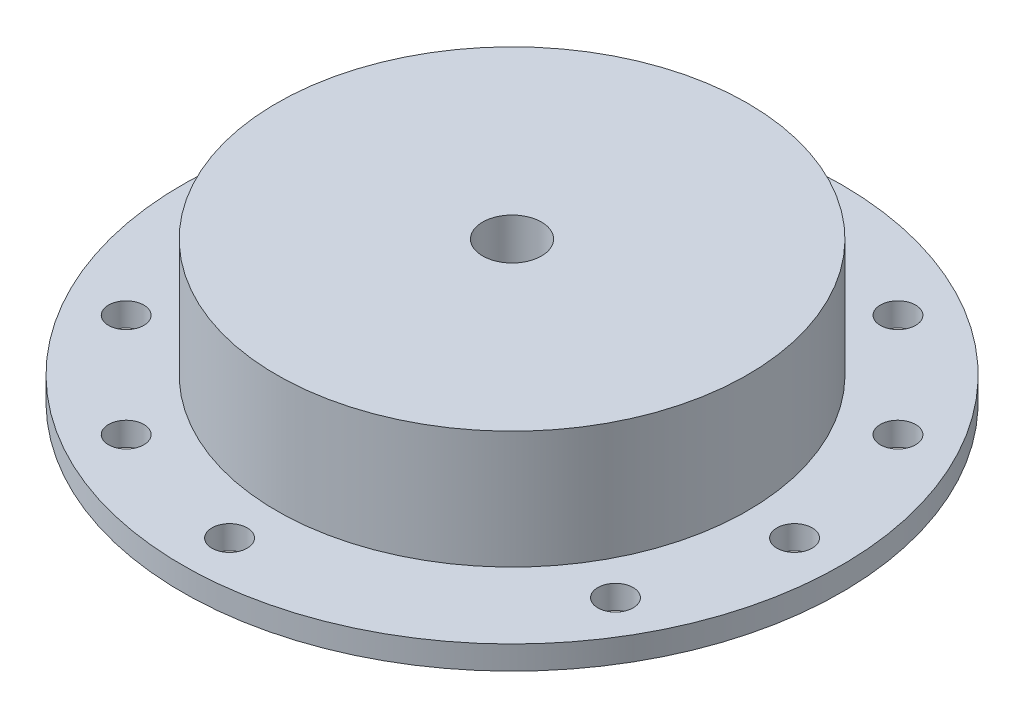
ISO-10303-21;
HEADER;
FILE_DESCRIPTION(('STEP AP214'),'2;1');
FILE_NAME('part.step','',(''),(''),'','','');
FILE_SCHEMA(('AUTOMOTIVE_DESIGN { 1 0 10303 214 1 1 1 1 }'));
ENDSEC;
DATA;
#1=APPLICATION_CONTEXT('core data for automotive mechanical design processes');
#2=APPLICATION_PROTOCOL_DEFINITION('international standard','automotive_design',2000,#1);
#3=PRODUCT_CONTEXT('',#1,'mechanical');
#4=PRODUCT('Part','Part','',(#3));
#5=PRODUCT_RELATED_PRODUCT_CATEGORY('part','',(#4));
#6=PRODUCT_DEFINITION_FORMATION('','',#4);
#7=PRODUCT_DEFINITION_CONTEXT('part definition',#1,'design');
#8=PRODUCT_DEFINITION('design','',#6,#7);
#9=PRODUCT_DEFINITION_SHAPE('','',#8);
#10=(LENGTH_UNIT() NAMED_UNIT(*) SI_UNIT(.MILLI.,.METRE.));
#11=(NAMED_UNIT(*) PLANE_ANGLE_UNIT() SI_UNIT($,.RADIAN.));
#12=(NAMED_UNIT(*) SI_UNIT($,.STERADIAN.) SOLID_ANGLE_UNIT());
#13=UNCERTAINTY_MEASURE_WITH_UNIT(LENGTH_MEASURE(1.E-05),#10,'distance_accuracy_value','');
#14=(GEOMETRIC_REPRESENTATION_CONTEXT(3) GLOBAL_UNCERTAINTY_ASSIGNED_CONTEXT((#13)) GLOBAL_UNIT_ASSIGNED_CONTEXT((#10,
#11,#12)) REPRESENTATION_CONTEXT('',''));
#15=CARTESIAN_POINT('',(0.,0.,0.));
#16=DIRECTION('',(0.,0.,1.));
#17=DIRECTION('',(1.,0.,0.));
#18=AXIS2_PLACEMENT_3D('',#15,#16,#17);
#19=CARTESIAN_POINT('',(63.5,38.1,0.));
#20=DIRECTION('',(0.,1.,0.));
#21=DIRECTION('',(0.,0.,1.));
#22=AXIS2_PLACEMENT_3D('',#19,#20,#21);
#23=PLANE('',#22);
#24=CARTESIAN_POINT('',(0.,38.1,0.));
#25=DIRECTION('',(0.,-1.,0.));
#26=DIRECTION('',(0.,0.,-1.));
#27=AXIS2_PLACEMENT_3D('',#24,#25,#26);
#28=CIRCLE('',#27,7.9375);
#29=CARTESIAN_POINT('',(0.,38.1,-7.9375));
#30=VERTEX_POINT('',#29);
#31=EDGE_CURVE('E10',#30,#30,#28,.T.);
#32=ORIENTED_EDGE('',*,*,#31,.T.);
#33=EDGE_LOOP('',(#32));
#34=FACE_BOUND('',#33,.T.);
#35=CARTESIAN_POINT('',(0.,38.1,0.));
#36=DIRECTION('',(0.,-1.,0.));
#37=DIRECTION('',(0.,0.,-1.));
#38=AXIS2_PLACEMENT_3D('',#35,#36,#37);
#39=CIRCLE('',#38,63.5);
#40=CARTESIAN_POINT('',(0.,38.1,-63.5));
#41=VERTEX_POINT('',#40);
#42=EDGE_CURVE('E56',#41,#41,#39,.T.);
#43=ORIENTED_EDGE('',*,*,#42,.F.);
#44=EDGE_LOOP('',(#43));
#45=FACE_BOUND('',#44,.T.);
#46=ADVANCED_FACE('F31',(#34,#45),#23,.T.);
#47=CARTESIAN_POINT('',(0.,0.,0.));
#48=DIRECTION('',(0.,-1.,0.));
#49=DIRECTION('',(0.,0.,-1.));
#50=AXIS2_PLACEMENT_3D('',#47,#48,#49);
#51=CYLINDRICAL_SURFACE('',#50,7.9375);
#52=CARTESIAN_POINT('',(0.,11.1125,0.));
#53=DIRECTION('',(0.,-1.,0.));
#54=DIRECTION('',(0.,0.,-1.));
#55=AXIS2_PLACEMENT_3D('',#52,#53,#54);
#56=CIRCLE('',#55,7.9375);
#57=CARTESIAN_POINT('',(0.,11.1125,-7.9375));
#58=VERTEX_POINT('',#57);
#59=EDGE_CURVE('E37',#58,#58,#56,.T.);
#60=ORIENTED_EDGE('',*,*,#59,.T.);
#61=EDGE_LOOP('',(#60));
#62=FACE_BOUND('',#61,.T.);
#63=ORIENTED_EDGE('',*,*,#31,.F.);
#64=EDGE_LOOP('',(#63));
#65=FACE_BOUND('',#64,.T.);
#66=ADVANCED_FACE('F173',(#62,#65),#51,.F.);
#67=CARTESIAN_POINT('',(0.,46.4910714285714,0.));
#68=DIRECTION('',(0.,-1.,0.));
#69=DIRECTION('',(0.,0.,-1.));
#70=AXIS2_PLACEMENT_3D('',#67,#68,#69);
#71=DEGENERATE_TOROIDAL_SURFACE('',#70,38.1,46.4910714285714,.T.);
#72=CARTESIAN_POINT('',(0.,0.,0.));
#73=DIRECTION('',(0.,-1.,0.));
#74=DIRECTION('',(0.,0.,-1.));
#75=AXIS2_PLACEMENT_3D('',#72,#73,#74);
#76=CIRCLE('',#75,38.1);
#77=CARTESIAN_POINT('',(0.,0.,-38.1));
#78=VERTEX_POINT('',#77);
#79=EDGE_CURVE('E41',#78,#78,#76,.T.);
#80=ORIENTED_EDGE('',*,*,#79,.T.);
#81=EDGE_LOOP('',(#80));
#82=FACE_BOUND('',#81,.T.);
#83=ORIENTED_EDGE('',*,*,#59,.F.);
#84=EDGE_LOOP('',(#83));
#85=FACE_BOUND('',#84,.T.);
#86=ADVANCED_FACE('F166',(#82,#85),#71,.T.);
#87=CARTESIAN_POINT('',(38.1,0.,0.));
#88=DIRECTION('',(0.,-1.,0.));
#89=DIRECTION('',(0.,0.,-1.));
#90=AXIS2_PLACEMENT_3D('',#87,#88,#89);
#91=PLANE('',#90);
#92=CARTESIAN_POINT('',(-38.0999999999991,0.,65.9911357683747));
#93=DIRECTION('',(0.,1.,0.));
#94=DIRECTION('',(0.,0.,1.));
#95=AXIS2_PLACEMENT_3D('',#92,#93,#94);
#96=CIRCLE('',#95,4.76249999999999);
#97=CARTESIAN_POINT('',(-38.0999999999991,0.,70.7536357683747));
#98=VERTEX_POINT('',#97);
#99=EDGE_CURVE('E119',#98,#98,#96,.T.);
#100=ORIENTED_EDGE('',*,*,#99,.T.);
#101=EDGE_LOOP('',(#100));
#102=FACE_BOUND('',#101,.T.);
#103=CARTESIAN_POINT('',(-65.9911357683738,0.,38.1000000000008));
#104=DIRECTION('',(0.,1.,0.));
#105=DIRECTION('',(0.,0.,1.));
#106=AXIS2_PLACEMENT_3D('',#103,#104,#105);
#107=CIRCLE('',#106,4.76249999999999);
#108=CARTESIAN_POINT('',(-65.9911357683738,0.,42.8625000000008));
#109=VERTEX_POINT('',#108);
#110=EDGE_CURVE('E113',#109,#109,#107,.T.);
#111=ORIENTED_EDGE('',*,*,#110,.T.);
#112=EDGE_LOOP('',(#111));
#113=FACE_BOUND('',#112,.T.);
#114=CARTESIAN_POINT('',(-76.2,0.,8.08560974915401E-13));
#115=DIRECTION('',(0.,1.,0.));
#116=DIRECTION('',(0.,0.,1.));
#117=AXIS2_PLACEMENT_3D('',#114,#115,#116);
#118=CIRCLE('',#117,4.76249999999999);
#119=CARTESIAN_POINT('',(-76.2,0.,4.7625000000008));
#120=VERTEX_POINT('',#119);
#121=EDGE_CURVE('E107',#120,#120,#118,.T.);
#122=ORIENTED_EDGE('',*,*,#121,.T.);
#123=EDGE_LOOP('',(#122));
#124=FACE_BOUND('',#123,.T.);
#125=CARTESIAN_POINT('',(-65.9911357683746,0.,-38.0999999999994));
#126=DIRECTION('',(0.,1.,0.));
#127=DIRECTION('',(0.,0.,1.));
#128=AXIS2_PLACEMENT_3D('',#125,#126,#127);
#129=CIRCLE('',#128,4.76249999999999);
#130=CARTESIAN_POINT('',(-65.9911357683746,0.,-33.3374999999994));
#131=VERTEX_POINT('',#130);
#132=EDGE_CURVE('E101',#131,#131,#129,.T.);
#133=ORIENTED_EDGE('',*,*,#132,.T.);
#134=EDGE_LOOP('',(#133));
#135=FACE_BOUND('',#134,.T.);
#136=CARTESIAN_POINT('',(-38.1000000000005,0.,-65.9911357683739));
#137=DIRECTION('',(0.,1.,0.));
#138=DIRECTION('',(0.,0.,1.));
#139=AXIS2_PLACEMENT_3D('',#136,#137,#138);
#140=CIRCLE('',#139,4.76249999999999);
#141=CARTESIAN_POINT('',(-38.1000000000005,0.,-61.2286357683739));
#142=VERTEX_POINT('',#141);
#143=EDGE_CURVE('E95',#142,#142,#140,.T.);
#144=ORIENTED_EDGE('',*,*,#143,.T.);
#145=EDGE_LOOP('',(#144));
#146=FACE_BOUND('',#145,.T.);
#147=CARTESIAN_POINT('',(0.,0.,-76.2));
#148=DIRECTION('',(0.,1.,0.));
#149=DIRECTION('',(0.,0.,1.));
#150=AXIS2_PLACEMENT_3D('',#147,#148,#149);
#151=CIRCLE('',#150,4.76249999999999);
#152=CARTESIAN_POINT('',(0.,0.,-71.4375));
#153=VERTEX_POINT('',#152);
#154=EDGE_CURVE('E89',#153,#153,#151,.T.);
#155=ORIENTED_EDGE('',*,*,#154,.T.);
#156=EDGE_LOOP('',(#155));
#157=FACE_BOUND('',#156,.T.);
#158=CARTESIAN_POINT('',(38.0999999999996,0.,-65.9911357683744));
#159=DIRECTION('',(0.,1.,0.));
#160=DIRECTION('',(0.,0.,1.));
#161=AXIS2_PLACEMENT_3D('',#158,#159,#160);
#162=CIRCLE('',#161,4.76249999999999);
#163=CARTESIAN_POINT('',(38.0999999999996,0.,-61.2286357683745));
#164=VERTEX_POINT('',#163);
#165=EDGE_CURVE('E83',#164,#164,#162,.T.);
#166=ORIENTED_EDGE('',*,*,#165,.T.);
#167=EDGE_LOOP('',(#166));
#168=FACE_BOUND('',#167,.T.);
#169=CARTESIAN_POINT('',(65.9911357683741,0.,-38.1000000000003));
#170=DIRECTION('',(0.,1.,0.));
#171=DIRECTION('',(0.,0.,1.));
#172=AXIS2_PLACEMENT_3D('',#169,#170,#171);
#173=CIRCLE('',#172,4.76249999999999);
#174=CARTESIAN_POINT('',(65.9911357683741,0.,-33.3375000000003));
#175=VERTEX_POINT('',#174);
#176=EDGE_CURVE('E77',#175,#175,#173,.T.);
#177=ORIENTED_EDGE('',*,*,#176,.T.);
#178=EDGE_LOOP('',(#177));
#179=FACE_BOUND('',#178,.T.);
#180=CARTESIAN_POINT('',(76.2,0.,-2.76459218875708E-13));
#181=DIRECTION('',(0.,1.,0.));
#182=DIRECTION('',(0.,0.,1.));
#183=AXIS2_PLACEMENT_3D('',#180,#181,#182);
#184=CIRCLE('',#183,4.76249999999999);
#185=CARTESIAN_POINT('',(76.2,0.,4.76249999999971));
#186=VERTEX_POINT('',#185);
#187=EDGE_CURVE('E71',#186,#186,#184,.T.);
#188=ORIENTED_EDGE('',*,*,#187,.T.);
#189=EDGE_LOOP('',(#188));
#190=FACE_BOUND('',#189,.T.);
#191=CARTESIAN_POINT('',(65.9911357683743,0.,38.0999999999998));
#192=DIRECTION('',(0.,1.,0.));
#193=DIRECTION('',(0.,0.,1.));
#194=AXIS2_PLACEMENT_3D('',#191,#192,#193);
#195=CIRCLE('',#194,4.76249999999999);
#196=CARTESIAN_POINT('',(65.9911357683743,0.,42.8624999999998));
#197=VERTEX_POINT('',#196);
#198=EDGE_CURVE('E65',#197,#197,#195,.T.);
#199=ORIENTED_EDGE('',*,*,#198,.T.);
#200=EDGE_LOOP('',(#199));
#201=FACE_BOUND('',#200,.T.);
#202=CARTESIAN_POINT('',(0.,0.,76.2));
#203=DIRECTION('',(0.,1.,0.));
#204=DIRECTION('',(0.,0.,1.));
#205=AXIS2_PLACEMENT_3D('',#202,#203,#204);
#206=CIRCLE('',#205,4.76249999999999);
#207=CARTESIAN_POINT('',(0.,0.,80.9625));
#208=VERTEX_POINT('',#207);
#209=EDGE_CURVE('E59',#208,#208,#206,.T.);
#210=ORIENTED_EDGE('',*,*,#209,.T.);
#211=EDGE_LOOP('',(#210));
#212=FACE_BOUND('',#211,.T.);
#213=CARTESIAN_POINT('',(0.,0.,0.));
#214=DIRECTION('',(0.,-1.,0.));
#215=DIRECTION('',(0.,0.,-1.));
#216=AXIS2_PLACEMENT_3D('',#213,#214,#215);
#217=CIRCLE('',#216,88.9);
#218=CARTESIAN_POINT('',(0.,0.,-88.9));
#219=VERTEX_POINT('',#218);
#220=EDGE_CURVE('E45',#219,#219,#217,.T.);
#221=ORIENTED_EDGE('',*,*,#220,.T.);
#222=EDGE_LOOP('',(#221));
#223=FACE_BOUND('',#222,.T.);
#224=ORIENTED_EDGE('',*,*,#79,.F.);
#225=EDGE_LOOP('',(#224));
#226=FACE_BOUND('',#225,.T.);
#227=ADVANCED_FACE('F160',(#102,#113,#124,#135,#146,#157,#168,#179,#190,#201,#212,#223,#226),
#91,.T.);
#228=CARTESIAN_POINT('',(0.,0.,0.));
#229=DIRECTION('',(0.,-1.,0.));
#230=DIRECTION('',(0.,0.,-1.));
#231=AXIS2_PLACEMENT_3D('',#228,#229,#230);
#232=CYLINDRICAL_SURFACE('',#231,88.9);
#233=CARTESIAN_POINT('',(0.,6.35,0.));
#234=DIRECTION('',(0.,-1.,0.));
#235=DIRECTION('',(0.,0.,-1.));
#236=AXIS2_PLACEMENT_3D('',#233,#234,#235);
#237=CIRCLE('',#236,88.9);
#238=CARTESIAN_POINT('',(0.,6.35,-88.9));
#239=VERTEX_POINT('',#238);
#240=EDGE_CURVE('E50',#239,#239,#237,.T.);
#241=ORIENTED_EDGE('',*,*,#240,.T.);
#242=EDGE_LOOP('',(#241));
#243=FACE_BOUND('',#242,.T.);
#244=ORIENTED_EDGE('',*,*,#220,.F.);
#245=EDGE_LOOP('',(#244));
#246=FACE_BOUND('',#245,.T.);
#247=ADVANCED_FACE('F132',(#243,#246),#232,.T.);
#248=CARTESIAN_POINT('',(88.9,6.34999999999999,0.));
#249=DIRECTION('',(0.,1.,0.));
#250=DIRECTION('',(0.,0.,1.));
#251=AXIS2_PLACEMENT_3D('',#248,#249,#250);
#252=PLANE('',#251);
#253=CARTESIAN_POINT('',(-38.0999999999991,6.35,65.9911357683747));
#254=DIRECTION('',(0.,1.,0.));
#255=DIRECTION('',(0.,0.,1.));
#256=AXIS2_PLACEMENT_3D('',#253,#254,#255);
#257=CIRCLE('',#256,4.76249999999999);
#258=CARTESIAN_POINT('',(-38.0999999999991,6.35,70.7536357683747));
#259=VERTEX_POINT('',#258);
#260=EDGE_CURVE('E122',#259,#259,#257,.T.);
#261=ORIENTED_EDGE('',*,*,#260,.F.);
#262=EDGE_LOOP('',(#261));
#263=FACE_BOUND('',#262,.T.);
#264=CARTESIAN_POINT('',(-65.9911357683738,6.35,38.1000000000008));
#265=DIRECTION('',(0.,1.,0.));
#266=DIRECTION('',(0.,0.,1.));
#267=AXIS2_PLACEMENT_3D('',#264,#265,#266);
#268=CIRCLE('',#267,4.76249999999999);
#269=CARTESIAN_POINT('',(-65.9911357683738,6.35,42.8625000000008));
#270=VERTEX_POINT('',#269);
#271=EDGE_CURVE('E116',#270,#270,#268,.T.);
#272=ORIENTED_EDGE('',*,*,#271,.F.);
#273=EDGE_LOOP('',(#272));
#274=FACE_BOUND('',#273,.T.);
#275=CARTESIAN_POINT('',(-76.2,6.35,8.08560974915401E-13));
#276=DIRECTION('',(0.,1.,0.));
#277=DIRECTION('',(0.,0.,1.));
#278=AXIS2_PLACEMENT_3D('',#275,#276,#277);
#279=CIRCLE('',#278,4.76249999999999);
#280=CARTESIAN_POINT('',(-76.2,6.35,4.7625000000008));
#281=VERTEX_POINT('',#280);
#282=EDGE_CURVE('E110',#281,#281,#279,.T.);
#283=ORIENTED_EDGE('',*,*,#282,.F.);
#284=EDGE_LOOP('',(#283));
#285=FACE_BOUND('',#284,.T.);
#286=CARTESIAN_POINT('',(-65.9911357683746,6.35,-38.0999999999994));
#287=DIRECTION('',(0.,1.,0.));
#288=DIRECTION('',(0.,0.,1.));
#289=AXIS2_PLACEMENT_3D('',#286,#287,#288);
#290=CIRCLE('',#289,4.76249999999999);
#291=CARTESIAN_POINT('',(-65.9911357683746,6.35,-33.3374999999994));
#292=VERTEX_POINT('',#291);
#293=EDGE_CURVE('E104',#292,#292,#290,.T.);
#294=ORIENTED_EDGE('',*,*,#293,.F.);
#295=EDGE_LOOP('',(#294));
#296=FACE_BOUND('',#295,.T.);
#297=CARTESIAN_POINT('',(-38.1000000000005,6.35,-65.9911357683739));
#298=DIRECTION('',(0.,1.,0.));
#299=DIRECTION('',(0.,0.,1.));
#300=AXIS2_PLACEMENT_3D('',#297,#298,#299);
#301=CIRCLE('',#300,4.76249999999999);
#302=CARTESIAN_POINT('',(-38.1000000000005,6.35,-61.2286357683739));
#303=VERTEX_POINT('',#302);
#304=EDGE_CURVE('E98',#303,#303,#301,.T.);
#305=ORIENTED_EDGE('',*,*,#304,.F.);
#306=EDGE_LOOP('',(#305));
#307=FACE_BOUND('',#306,.T.);
#308=CARTESIAN_POINT('',(0.,6.35,-76.2));
#309=DIRECTION('',(0.,1.,0.));
#310=DIRECTION('',(0.,0.,1.));
#311=AXIS2_PLACEMENT_3D('',#308,#309,#310);
#312=CIRCLE('',#311,4.76249999999999);
#313=CARTESIAN_POINT('',(0.,6.35,-71.4375));
#314=VERTEX_POINT('',#313);
#315=EDGE_CURVE('E92',#314,#314,#312,.T.);
#316=ORIENTED_EDGE('',*,*,#315,.F.);
#317=EDGE_LOOP('',(#316));
#318=FACE_BOUND('',#317,.T.);
#319=CARTESIAN_POINT('',(38.0999999999996,6.35,-65.9911357683744));
#320=DIRECTION('',(0.,1.,0.));
#321=DIRECTION('',(0.,0.,1.));
#322=AXIS2_PLACEMENT_3D('',#319,#320,#321);
#323=CIRCLE('',#322,4.76249999999999);
#324=CARTESIAN_POINT('',(38.0999999999996,6.35,-61.2286357683745));
#325=VERTEX_POINT('',#324);
#326=EDGE_CURVE('E86',#325,#325,#323,.T.);
#327=ORIENTED_EDGE('',*,*,#326,.F.);
#328=EDGE_LOOP('',(#327));
#329=FACE_BOUND('',#328,.T.);
#330=CARTESIAN_POINT('',(65.9911357683741,6.35,-38.1000000000003));
#331=DIRECTION('',(0.,1.,0.));
#332=DIRECTION('',(0.,0.,1.));
#333=AXIS2_PLACEMENT_3D('',#330,#331,#332);
#334=CIRCLE('',#333,4.76249999999999);
#335=CARTESIAN_POINT('',(65.9911357683741,6.35,-33.3375000000003));
#336=VERTEX_POINT('',#335);
#337=EDGE_CURVE('E80',#336,#336,#334,.T.);
#338=ORIENTED_EDGE('',*,*,#337,.F.);
#339=EDGE_LOOP('',(#338));
#340=FACE_BOUND('',#339,.T.);
#341=CARTESIAN_POINT('',(76.2,6.35,-2.76459218875708E-13));
#342=DIRECTION('',(0.,1.,0.));
#343=DIRECTION('',(0.,0.,1.));
#344=AXIS2_PLACEMENT_3D('',#341,#342,#343);
#345=CIRCLE('',#344,4.76249999999999);
#346=CARTESIAN_POINT('',(76.2,6.35,4.76249999999971));
#347=VERTEX_POINT('',#346);
#348=EDGE_CURVE('E74',#347,#347,#345,.T.);
#349=ORIENTED_EDGE('',*,*,#348,.F.);
#350=EDGE_LOOP('',(#349));
#351=FACE_BOUND('',#350,.T.);
#352=CARTESIAN_POINT('',(65.9911357683743,6.35,38.0999999999998));
#353=DIRECTION('',(0.,1.,0.));
#354=DIRECTION('',(0.,0.,1.));
#355=AXIS2_PLACEMENT_3D('',#352,#353,#354);
#356=CIRCLE('',#355,4.76249999999999);
#357=CARTESIAN_POINT('',(65.9911357683743,6.35,42.8624999999998));
#358=VERTEX_POINT('',#357);
#359=EDGE_CURVE('E68',#358,#358,#356,.T.);
#360=ORIENTED_EDGE('',*,*,#359,.F.);
#361=EDGE_LOOP('',(#360));
#362=FACE_BOUND('',#361,.T.);
#363=CARTESIAN_POINT('',(0.,6.35,76.2));
#364=DIRECTION('',(0.,1.,0.));
#365=DIRECTION('',(0.,0.,1.));
#366=AXIS2_PLACEMENT_3D('',#363,#364,#365);
#367=CIRCLE('',#366,4.76249999999999);
#368=CARTESIAN_POINT('',(0.,6.35,80.9625));
#369=VERTEX_POINT('',#368);
#370=EDGE_CURVE('E62',#369,#369,#367,.T.);
#371=ORIENTED_EDGE('',*,*,#370,.F.);
#372=EDGE_LOOP('',(#371));
#373=FACE_BOUND('',#372,.T.);
#374=CARTESIAN_POINT('',(0.,6.34999999999999,0.));
#375=DIRECTION('',(0.,-1.,0.));
#376=DIRECTION('',(0.,0.,-1.));
#377=AXIS2_PLACEMENT_3D('',#374,#375,#376);
#378=CIRCLE('',#377,63.5);
#379=CARTESIAN_POINT('',(0.,6.34999999999999,-63.5));
#380=VERTEX_POINT('',#379);
#381=EDGE_CURVE('E53',#380,#380,#378,.T.);
#382=ORIENTED_EDGE('',*,*,#381,.T.);
#383=EDGE_LOOP('',(#382));
#384=FACE_BOUND('',#383,.T.);
#385=ORIENTED_EDGE('',*,*,#240,.F.);
#386=EDGE_LOOP('',(#385));
#387=FACE_BOUND('',#386,.T.);
#388=ADVANCED_FACE('F128',(#263,#274,#285,#296,#307,#318,#329,#340,#351,#362,#373,#384,#387),
#252,.T.);
#389=CARTESIAN_POINT('',(0.,0.,0.));
#390=DIRECTION('',(0.,-1.,0.));
#391=DIRECTION('',(0.,0.,-1.));
#392=AXIS2_PLACEMENT_3D('',#389,#390,#391);
#393=CYLINDRICAL_SURFACE('',#392,63.5);
#394=ORIENTED_EDGE('',*,*,#42,.T.);
#395=EDGE_LOOP('',(#394));
#396=FACE_BOUND('',#395,.T.);
#397=ORIENTED_EDGE('',*,*,#381,.F.);
#398=EDGE_LOOP('',(#397));
#399=FACE_BOUND('',#398,.T.);
#400=ADVANCED_FACE('F131',(#396,#399),#393,.T.);
#401=CARTESIAN_POINT('',(0.,6.34999999999999,76.2));
#402=DIRECTION('',(0.,1.,0.));
#403=DIRECTION('',(0.,0.,1.));
#404=AXIS2_PLACEMENT_3D('',#401,#402,#403);
#405=CYLINDRICAL_SURFACE('',#404,4.76249999999999);
#406=ORIENTED_EDGE('',*,*,#209,.F.);
#407=EDGE_LOOP('',(#406));
#408=FACE_BOUND('',#407,.T.);
#409=ORIENTED_EDGE('',*,*,#370,.T.);
#410=EDGE_LOOP('',(#409));
#411=FACE_BOUND('',#410,.T.);
#412=ADVANCED_FACE('F186',(#408,#411),#405,.F.);
#413=CARTESIAN_POINT('',(65.9911357683743,6.34999999999999,38.0999999999998));
#414=DIRECTION('',(0.,1.,0.));
#415=DIRECTION('',(0.,0.,1.));
#416=AXIS2_PLACEMENT_3D('',#413,#414,#415);
#417=CYLINDRICAL_SURFACE('',#416,4.76249999999999);
#418=ORIENTED_EDGE('',*,*,#198,.F.);
#419=EDGE_LOOP('',(#418));
#420=FACE_BOUND('',#419,.T.);
#421=ORIENTED_EDGE('',*,*,#359,.T.);
#422=EDGE_LOOP('',(#421));
#423=FACE_BOUND('',#422,.T.);
#424=ADVANCED_FACE('F191',(#420,#423),#417,.F.);
#425=CARTESIAN_POINT('',(76.2,6.34999999999999,-2.76459218875708E-13));
#426=DIRECTION('',(0.,1.,0.));
#427=DIRECTION('',(0.,0.,1.));
#428=AXIS2_PLACEMENT_3D('',#425,#426,#427);
#429=CYLINDRICAL_SURFACE('',#428,4.76249999999999);
#430=ORIENTED_EDGE('',*,*,#187,.F.);
#431=EDGE_LOOP('',(#430));
#432=FACE_BOUND('',#431,.T.);
#433=ORIENTED_EDGE('',*,*,#348,.T.);
#434=EDGE_LOOP('',(#433));
#435=FACE_BOUND('',#434,.T.);
#436=ADVANCED_FACE('F197',(#432,#435),#429,.F.);
#437=CARTESIAN_POINT('',(65.9911357683741,6.34999999999999,-38.1000000000003));
#438=DIRECTION('',(0.,1.,0.));
#439=DIRECTION('',(0.,0.,1.));
#440=AXIS2_PLACEMENT_3D('',#437,#438,#439);
#441=CYLINDRICAL_SURFACE('',#440,4.76249999999999);
#442=ORIENTED_EDGE('',*,*,#176,.F.);
#443=EDGE_LOOP('',(#442));
#444=FACE_BOUND('',#443,.T.);
#445=ORIENTED_EDGE('',*,*,#337,.T.);
#446=EDGE_LOOP('',(#445));
#447=FACE_BOUND('',#446,.T.);
#448=ADVANCED_FACE('F201',(#444,#447),#441,.F.);
#449=CARTESIAN_POINT('',(38.0999999999996,6.34999999999999,-65.9911357683744));
#450=DIRECTION('',(0.,1.,0.));
#451=DIRECTION('',(0.,0.,1.));
#452=AXIS2_PLACEMENT_3D('',#449,#450,#451);
#453=CYLINDRICAL_SURFACE('',#452,4.76249999999999);
#454=ORIENTED_EDGE('',*,*,#165,.F.);
#455=EDGE_LOOP('',(#454));
#456=FACE_BOUND('',#455,.T.);
#457=ORIENTED_EDGE('',*,*,#326,.T.);
#458=EDGE_LOOP('',(#457));
#459=FACE_BOUND('',#458,.T.);
#460=ADVANCED_FACE('F205',(#456,#459),#453,.F.);
#461=CARTESIAN_POINT('',(0.,6.34999999999999,-76.2));
#462=DIRECTION('',(0.,1.,0.));
#463=DIRECTION('',(0.,0.,1.));
#464=AXIS2_PLACEMENT_3D('',#461,#462,#463);
#465=CYLINDRICAL_SURFACE('',#464,4.76249999999999);
#466=ORIENTED_EDGE('',*,*,#154,.F.);
#467=EDGE_LOOP('',(#466));
#468=FACE_BOUND('',#467,.T.);
#469=ORIENTED_EDGE('',*,*,#315,.T.);
#470=EDGE_LOOP('',(#469));
#471=FACE_BOUND('',#470,.T.);
#472=ADVANCED_FACE('F209',(#468,#471),#465,.F.);
#473=CARTESIAN_POINT('',(-38.1000000000005,6.34999999999999,-65.9911357683739));
#474=DIRECTION('',(0.,1.,0.));
#475=DIRECTION('',(0.,0.,1.));
#476=AXIS2_PLACEMENT_3D('',#473,#474,#475);
#477=CYLINDRICAL_SURFACE('',#476,4.76249999999999);
#478=ORIENTED_EDGE('',*,*,#143,.F.);
#479=EDGE_LOOP('',(#478));
#480=FACE_BOUND('',#479,.T.);
#481=ORIENTED_EDGE('',*,*,#304,.T.);
#482=EDGE_LOOP('',(#481));
#483=FACE_BOUND('',#482,.T.);
#484=ADVANCED_FACE('F213',(#480,#483),#477,.F.);
#485=CARTESIAN_POINT('',(-65.9911357683746,6.34999999999999,-38.0999999999994));
#486=DIRECTION('',(0.,1.,0.));
#487=DIRECTION('',(0.,0.,1.));
#488=AXIS2_PLACEMENT_3D('',#485,#486,#487);
#489=CYLINDRICAL_SURFACE('',#488,4.76249999999999);
#490=ORIENTED_EDGE('',*,*,#132,.F.);
#491=EDGE_LOOP('',(#490));
#492=FACE_BOUND('',#491,.T.);
#493=ORIENTED_EDGE('',*,*,#293,.T.);
#494=EDGE_LOOP('',(#493));
#495=FACE_BOUND('',#494,.T.);
#496=ADVANCED_FACE('F217',(#492,#495),#489,.F.);
#497=CARTESIAN_POINT('',(-76.2,6.34999999999999,8.08560974915401E-13));
#498=DIRECTION('',(0.,1.,0.));
#499=DIRECTION('',(0.,0.,1.));
#500=AXIS2_PLACEMENT_3D('',#497,#498,#499);
#501=CYLINDRICAL_SURFACE('',#500,4.76249999999999);
#502=ORIENTED_EDGE('',*,*,#121,.F.);
#503=EDGE_LOOP('',(#502));
#504=FACE_BOUND('',#503,.T.);
#505=ORIENTED_EDGE('',*,*,#282,.T.);
#506=EDGE_LOOP('',(#505));
#507=FACE_BOUND('',#506,.T.);
#508=ADVANCED_FACE('F221',(#504,#507),#501,.F.);
#509=CARTESIAN_POINT('',(-65.9911357683738,6.34999999999999,38.1000000000008));
#510=DIRECTION('',(0.,1.,0.));
#511=DIRECTION('',(0.,0.,1.));
#512=AXIS2_PLACEMENT_3D('',#509,#510,#511);
#513=CYLINDRICAL_SURFACE('',#512,4.76249999999999);
#514=ORIENTED_EDGE('',*,*,#110,.F.);
#515=EDGE_LOOP('',(#514));
#516=FACE_BOUND('',#515,.T.);
#517=ORIENTED_EDGE('',*,*,#271,.T.);
#518=EDGE_LOOP('',(#517));
#519=FACE_BOUND('',#518,.T.);
#520=ADVANCED_FACE('F225',(#516,#519),#513,.F.);
#521=CARTESIAN_POINT('',(-38.0999999999991,6.34999999999999,65.9911357683747));
#522=DIRECTION('',(0.,1.,0.));
#523=DIRECTION('',(0.,0.,1.));
#524=AXIS2_PLACEMENT_3D('',#521,#522,#523);
#525=CYLINDRICAL_SURFACE('',#524,4.76249999999999);
#526=ORIENTED_EDGE('',*,*,#99,.F.);
#527=EDGE_LOOP('',(#526));
#528=FACE_BOUND('',#527,.T.);
#529=ORIENTED_EDGE('',*,*,#260,.T.);
#530=EDGE_LOOP('',(#529));
#531=FACE_BOUND('',#530,.T.);
#532=ADVANCED_FACE('F126',(#528,#531),#525,.F.);
#533=CLOSED_SHELL('',(#46,#66,#86,#227,#247,#388,#400,#412,#424,#436,#448,#460,#472,#484,#496,
#508,#520,#532));
#534=MANIFOLD_SOLID_BREP('B2',#533);
#535=ADVANCED_BREP_SHAPE_REPRESENTATION('',(#18,#534),#14);
#536=SHAPE_DEFINITION_REPRESENTATION(#9,#535);
ENDSEC;
END-ISO-10303-21;
